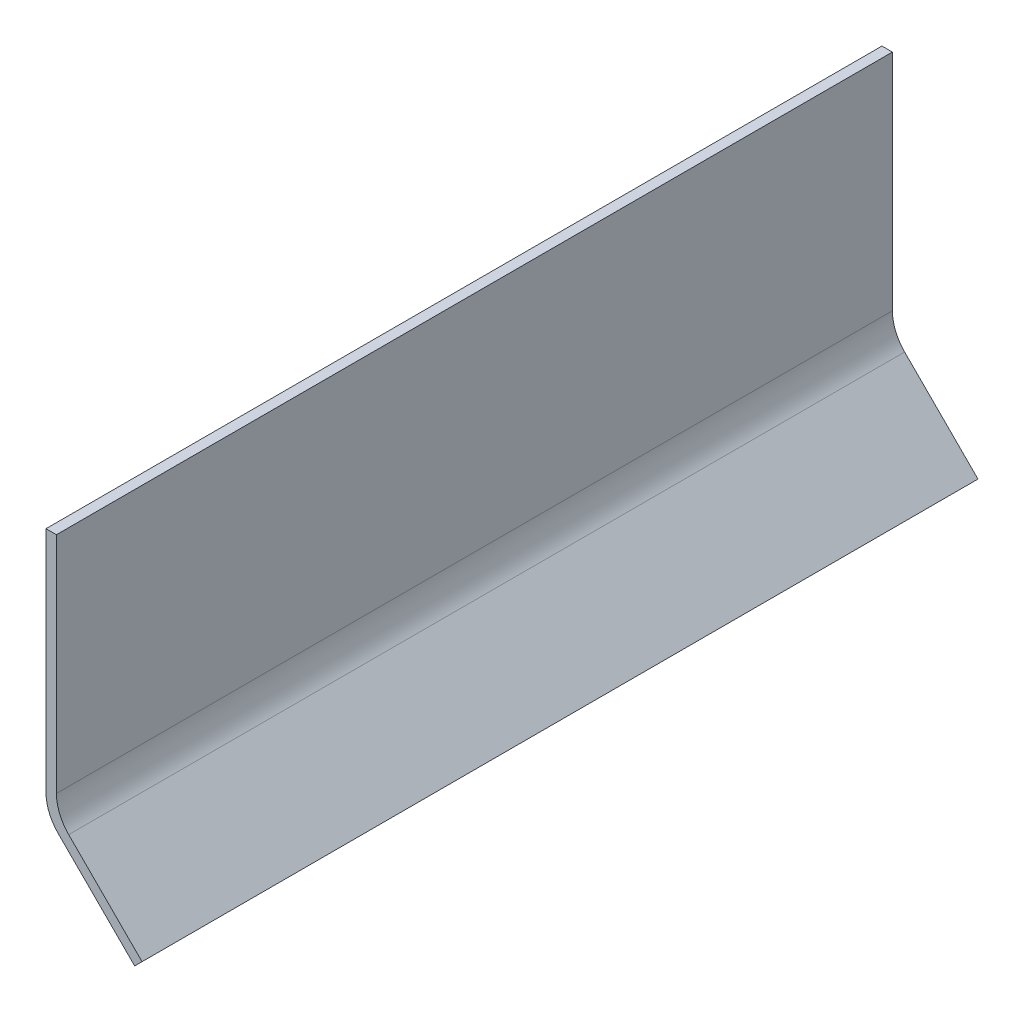
ISO-10303-21;
HEADER;
FILE_DESCRIPTION(('STEP AP214'),'2;1');
FILE_NAME('part.step','',(''),(''),'','','');
FILE_SCHEMA(('AUTOMOTIVE_DESIGN { 1 0 10303 214 1 1 1 1 }'));
ENDSEC;
DATA;
#1=APPLICATION_CONTEXT('core data for automotive mechanical design processes');
#2=APPLICATION_PROTOCOL_DEFINITION('international standard','automotive_design',2000,#1);
#3=PRODUCT_CONTEXT('',#1,'mechanical');
#4=PRODUCT('Part','Part','',(#3));
#5=PRODUCT_RELATED_PRODUCT_CATEGORY('part','',(#4));
#6=PRODUCT_DEFINITION_FORMATION('','',#4);
#7=PRODUCT_DEFINITION_CONTEXT('part definition',#1,'design');
#8=PRODUCT_DEFINITION('design','',#6,#7);
#9=PRODUCT_DEFINITION_SHAPE('','',#8);
#10=(LENGTH_UNIT() NAMED_UNIT(*) SI_UNIT(.MILLI.,.METRE.));
#11=(NAMED_UNIT(*) PLANE_ANGLE_UNIT() SI_UNIT($,.RADIAN.));
#12=(NAMED_UNIT(*) SI_UNIT($,.STERADIAN.) SOLID_ANGLE_UNIT());
#13=UNCERTAINTY_MEASURE_WITH_UNIT(LENGTH_MEASURE(1.E-05),#10,'distance_accuracy_value','');
#14=(GEOMETRIC_REPRESENTATION_CONTEXT(3) GLOBAL_UNCERTAINTY_ASSIGNED_CONTEXT((#13)) GLOBAL_UNIT_ASSIGNED_CONTEXT((#10,
#11,#12)) REPRESENTATION_CONTEXT('',''));
#15=CARTESIAN_POINT('',(0.,0.,0.));
#16=DIRECTION('',(0.,0.,1.));
#17=DIRECTION('',(1.,0.,0.));
#18=AXIS2_PLACEMENT_3D('',#15,#16,#17);
#19=CARTESIAN_POINT('',(0.,50.8,63.5));
#20=DIRECTION('',(0.,-1.,0.));
#21=DIRECTION('',(0.,0.,-1.));
#22=AXIS2_PLACEMENT_3D('',#19,#20,#21);
#23=PLANE('',#22);
#24=DIRECTION('',(-1.,0.,0.));
#25=VECTOR('',#24,1.);
#26=CARTESIAN_POINT('',(0.,50.8,-63.5));
#27=LINE('',#26,#25);
#28=CARTESIAN_POINT('',(1.5875,50.8,-63.5));
#29=VERTEX_POINT('',#28);
#30=CARTESIAN_POINT('',(0.,50.8,-63.5));
#31=VERTEX_POINT('',#30);
#32=EDGE_CURVE('E142',#29,#31,#27,.T.);
#33=ORIENTED_EDGE('',*,*,#32,.T.);
#34=DIRECTION('',(0.,0.,-1.));
#35=VECTOR('',#34,1.);
#36=CARTESIAN_POINT('',(0.,50.8,63.5));
#37=LINE('',#36,#35);
#38=CARTESIAN_POINT('',(0.,50.8,63.5));
#39=VERTEX_POINT('',#38);
#40=EDGE_CURVE('E11',#39,#31,#37,.T.);
#41=ORIENTED_EDGE('',*,*,#40,.F.);
#42=DIRECTION('',(-1.,0.,0.));
#43=VECTOR('',#42,1.);
#44=CARTESIAN_POINT('',(0.,50.8,63.5));
#45=LINE('',#44,#43);
#46=CARTESIAN_POINT('',(1.5875,50.8,63.5));
#47=VERTEX_POINT('',#46);
#48=EDGE_CURVE('E164',#47,#39,#45,.T.);
#49=ORIENTED_EDGE('',*,*,#48,.F.);
#50=DIRECTION('',(0.,0.,-1.));
#51=VECTOR('',#50,1.);
#52=CARTESIAN_POINT('',(1.5875,50.8,63.5));
#53=LINE('',#52,#51);
#54=EDGE_CURVE('E138',#47,#29,#53,.T.);
#55=ORIENTED_EDGE('',*,*,#54,.T.);
#56=EDGE_LOOP('',(#33,#41,#49,#55));
#57=FACE_BOUND('',#56,.T.);
#58=ADVANCED_FACE('F41',(#57),#23,.F.);
#59=CARTESIAN_POINT('',(0.,16.1006403026729,63.5));
#60=DIRECTION('',(1.,0.,0.));
#61=DIRECTION('',(0.,0.,-1.));
#62=AXIS2_PLACEMENT_3D('',#59,#60,#61);
#63=PLANE('',#62);
#64=DIRECTION('',(0.,-1.,0.));
#65=VECTOR('',#64,1.);
#66=CARTESIAN_POINT('',(0.,16.1006403026729,-63.5));
#67=LINE('',#66,#65);
#68=CARTESIAN_POINT('',(0.,16.1006403026729,-63.5));
#69=VERTEX_POINT('',#68);
#70=EDGE_CURVE('E146',#31,#69,#67,.T.);
#71=ORIENTED_EDGE('',*,*,#70,.T.);
#72=DIRECTION('',(0.,0.,-1.));
#73=VECTOR('',#72,1.);
#74=CARTESIAN_POINT('',(0.,16.1006403026729,63.5));
#75=LINE('',#74,#73);
#76=CARTESIAN_POINT('',(0.,16.1006403026729,63.5));
#77=VERTEX_POINT('',#76);
#78=EDGE_CURVE('E50',#77,#69,#75,.T.);
#79=ORIENTED_EDGE('',*,*,#78,.F.);
#80=DIRECTION('',(0.,-1.,0.));
#81=VECTOR('',#80,1.);
#82=CARTESIAN_POINT('',(0.,16.1006403026729,63.5));
#83=LINE('',#82,#81);
#84=EDGE_CURVE('E101',#39,#77,#83,.T.);
#85=ORIENTED_EDGE('',*,*,#84,.F.);
#86=ORIENTED_EDGE('',*,*,#40,.T.);
#87=EDGE_LOOP('',(#71,#79,#85,#86));
#88=FACE_BOUND('',#87,.T.);
#89=ADVANCED_FACE('F210',(#88),#63,.F.);
#90=CARTESIAN_POINT('',(6.35,16.1006403026729,63.5));
#91=DIRECTION('',(0.,0.,-1.));
#92=DIRECTION('',(-1.,0.,0.));
#93=AXIS2_PLACEMENT_3D('',#90,#91,#92);
#94=CYLINDRICAL_SURFACE('',#93,6.35);
#95=CARTESIAN_POINT('',(6.35,16.1006403026729,-63.5));
#96=DIRECTION('',(0.,0.,1.));
#97=DIRECTION('',(-1.,0.,0.));
#98=AXIS2_PLACEMENT_3D('',#95,#96,#97);
#99=CIRCLE('',#98,6.35);
#100=CARTESIAN_POINT('',(1.8598719394654,11.6105122421384,-63.5));
#101=VERTEX_POINT('',#100);
#102=EDGE_CURVE('E149',#69,#101,#99,.T.);
#103=ORIENTED_EDGE('',*,*,#102,.T.);
#104=DIRECTION('',(0.,0.,-1.));
#105=VECTOR('',#104,1.);
#106=CARTESIAN_POINT('',(1.8598719394654,11.6105122421384,63.5));
#107=LINE('',#106,#105);
#108=CARTESIAN_POINT('',(1.8598719394654,11.6105122421384,63.5));
#109=VERTEX_POINT('',#108);
#110=EDGE_CURVE('E175',#109,#101,#107,.T.);
#111=ORIENTED_EDGE('',*,*,#110,.F.);
#112=CARTESIAN_POINT('',(6.35,16.1006403026729,63.5));
#113=DIRECTION('',(0.,0.,1.));
#114=DIRECTION('',(-1.,0.,0.));
#115=AXIS2_PLACEMENT_3D('',#112,#113,#114);
#116=CIRCLE('',#115,6.35);
#117=EDGE_CURVE('E185',#77,#109,#116,.T.);
#118=ORIENTED_EDGE('',*,*,#117,.F.);
#119=ORIENTED_EDGE('',*,*,#78,.T.);
#120=EDGE_LOOP('',(#103,#111,#118,#119));
#121=FACE_BOUND('',#120,.T.);
#122=ADVANCED_FACE('F183',(#121),#94,.T.);
#123=CARTESIAN_POINT('',(1.8598719394654,11.6105122421384,63.5));
#124=DIRECTION('',(0.707106781186552,0.707106781186543,0.));
#125=DIRECTION('',(-0.707106781186543,0.707106781186552,0.));
#126=AXIS2_PLACEMENT_3D('',#123,#124,#125);
#127=PLANE('',#126);
#128=DIRECTION('',(0.707106781186543,-0.707106781186552,0.));
#129=VECTOR('',#128,1.);
#130=CARTESIAN_POINT('',(1.8598719394654,11.6105122421384,-63.5));
#131=LINE('',#130,#129);
#132=CARTESIAN_POINT('',(13.4703841816037,0.,-63.5));
#133=VERTEX_POINT('',#132);
#134=EDGE_CURVE('E152',#101,#133,#131,.T.);
#135=ORIENTED_EDGE('',*,*,#134,.T.);
#136=DIRECTION('',(0.,0.,-1.));
#137=VECTOR('',#136,1.);
#138=CARTESIAN_POINT('',(13.4703841816037,0.,63.5));
#139=LINE('',#138,#137);
#140=CARTESIAN_POINT('',(13.4703841816037,0.,63.5));
#141=VERTEX_POINT('',#140);
#142=EDGE_CURVE('E171',#141,#133,#139,.T.);
#143=ORIENTED_EDGE('',*,*,#142,.F.);
#144=DIRECTION('',(0.707106781186543,-0.707106781186552,0.));
#145=VECTOR('',#144,1.);
#146=CARTESIAN_POINT('',(1.8598719394654,11.6105122421384,63.5));
#147=LINE('',#146,#145);
#148=EDGE_CURVE('E198',#109,#141,#147,.T.);
#149=ORIENTED_EDGE('',*,*,#148,.F.);
#150=ORIENTED_EDGE('',*,*,#110,.T.);
#151=EDGE_LOOP('',(#135,#143,#149,#150));
#152=FACE_BOUND('',#151,.T.);
#153=ADVANCED_FACE('F193',(#152),#127,.F.);
#154=CARTESIAN_POINT('',(14.5929161967373,1.12253201513364,63.5));
#155=DIRECTION('',(-0.707106781186543,0.707106781186552,0.));
#156=DIRECTION('',(-0.707106781186552,-0.707106781186543,0.));
#157=AXIS2_PLACEMENT_3D('',#154,#155,#156);
#158=PLANE('',#157);
#159=DIRECTION('',(0.707106781186552,0.707106781186543,0.));
#160=VECTOR('',#159,1.);
#161=CARTESIAN_POINT('',(14.5929161967373,1.12253201513364,-63.5));
#162=LINE('',#161,#160);
#163=CARTESIAN_POINT('',(14.5929161967373,1.12253201513364,-63.5));
#164=VERTEX_POINT('',#163);
#165=EDGE_CURVE('E155',#133,#164,#162,.T.);
#166=ORIENTED_EDGE('',*,*,#165,.T.);
#167=DIRECTION('',(0.,0.,-1.));
#168=VECTOR('',#167,1.);
#169=CARTESIAN_POINT('',(14.5929161967373,1.12253201513364,63.5));
#170=LINE('',#169,#168);
#171=CARTESIAN_POINT('',(14.5929161967373,1.12253201513364,63.5));
#172=VERTEX_POINT('',#171);
#173=EDGE_CURVE('E131',#172,#164,#170,.T.);
#174=ORIENTED_EDGE('',*,*,#173,.F.);
#175=DIRECTION('',(0.707106781186552,0.707106781186543,0.));
#176=VECTOR('',#175,1.);
#177=CARTESIAN_POINT('',(14.5929161967373,1.12253201513364,63.5));
#178=LINE('',#177,#176);
#179=EDGE_CURVE('E120',#141,#172,#178,.T.);
#180=ORIENTED_EDGE('',*,*,#179,.F.);
#181=ORIENTED_EDGE('',*,*,#142,.T.);
#182=EDGE_LOOP('',(#166,#174,#180,#181));
#183=FACE_BOUND('',#182,.T.);
#184=ADVANCED_FACE('F196',(#183),#158,.F.);
#185=CARTESIAN_POINT('',(3.4473719394654,12.2680762724057,63.5));
#186=DIRECTION('',(-0.707106781186552,-0.707106781186543,0.));
#187=DIRECTION('',(0.707106781186543,-0.707106781186552,0.));
#188=AXIS2_PLACEMENT_3D('',#185,#186,#187);
#189=PLANE('',#188);
#190=DIRECTION('',(-0.707106781186543,0.707106781186552,0.));
#191=VECTOR('',#190,1.);
#192=CARTESIAN_POINT('',(3.4473719394654,12.2680762724057,-63.5));
#193=LINE('',#192,#191);
#194=CARTESIAN_POINT('',(3.4473719394654,12.2680762724057,-63.5));
#195=VERTEX_POINT('',#194);
#196=EDGE_CURVE('E129',#164,#195,#193,.T.);
#197=ORIENTED_EDGE('',*,*,#196,.T.);
#198=DIRECTION('',(0.,0.,-1.));
#199=VECTOR('',#198,1.);
#200=CARTESIAN_POINT('',(3.4473719394654,12.2680762724057,63.5));
#201=LINE('',#200,#199);
#202=CARTESIAN_POINT('',(3.4473719394654,12.2680762724057,63.5));
#203=VERTEX_POINT('',#202);
#204=EDGE_CURVE('E126',#203,#195,#201,.T.);
#205=ORIENTED_EDGE('',*,*,#204,.F.);
#206=DIRECTION('',(-0.707106781186543,0.707106781186552,0.));
#207=VECTOR('',#206,1.);
#208=CARTESIAN_POINT('',(3.4473719394654,12.2680762724057,63.5));
#209=LINE('',#208,#207);
#210=EDGE_CURVE('E114',#172,#203,#209,.T.);
#211=ORIENTED_EDGE('',*,*,#210,.F.);
#212=ORIENTED_EDGE('',*,*,#173,.T.);
#213=EDGE_LOOP('',(#197,#205,#211,#212));
#214=FACE_BOUND('',#213,.T.);
#215=ADVANCED_FACE('F127',(#214),#189,.F.);
#216=CARTESIAN_POINT('',(7.93750000000001,16.7582043329402,63.5));
#217=DIRECTION('',(0.,0.,-1.));
#218=DIRECTION('',(-1.,0.,0.));
#219=AXIS2_PLACEMENT_3D('',#216,#217,#218);
#220=CYLINDRICAL_SURFACE('',#219,6.35);
#221=CARTESIAN_POINT('',(7.93750000000001,16.7582043329402,-63.5));
#222=DIRECTION('',(0.,0.,-1.));
#223=DIRECTION('',(1.,0.,0.));
#224=AXIS2_PLACEMENT_3D('',#221,#222,#223);
#225=CIRCLE('',#224,6.35);
#226=CARTESIAN_POINT('',(1.58750000000001,16.7582043329402,-63.5));
#227=VERTEX_POINT('',#226);
#228=EDGE_CURVE('E87',#195,#227,#225,.T.);
#229=ORIENTED_EDGE('',*,*,#228,.T.);
#230=DIRECTION('',(0.,0.,-1.));
#231=VECTOR('',#230,1.);
#232=CARTESIAN_POINT('',(1.58750000000001,16.7582043329402,63.5));
#233=LINE('',#232,#231);
#234=CARTESIAN_POINT('',(1.58750000000001,16.7582043329402,63.5));
#235=VERTEX_POINT('',#234);
#236=EDGE_CURVE('E132',#235,#227,#233,.T.);
#237=ORIENTED_EDGE('',*,*,#236,.F.);
#238=CARTESIAN_POINT('',(7.93750000000001,16.7582043329402,63.5));
#239=DIRECTION('',(0.,0.,-1.));
#240=DIRECTION('',(1.,0.,0.));
#241=AXIS2_PLACEMENT_3D('',#238,#239,#240);
#242=CIRCLE('',#241,6.35);
#243=EDGE_CURVE('E118',#203,#235,#242,.T.);
#244=ORIENTED_EDGE('',*,*,#243,.F.);
#245=ORIENTED_EDGE('',*,*,#204,.T.);
#246=EDGE_LOOP('',(#229,#237,#244,#245));
#247=FACE_BOUND('',#246,.T.);
#248=ADVANCED_FACE('F134',(#247),#220,.F.);
#249=CARTESIAN_POINT('',(1.5875,50.8,63.5));
#250=DIRECTION('',(-1.,0.,0.));
#251=DIRECTION('',(0.,-1.,0.));
#252=AXIS2_PLACEMENT_3D('',#249,#250,#251);
#253=PLANE('',#252);
#254=DIRECTION('',(0.,1.,0.));
#255=VECTOR('',#254,1.);
#256=CARTESIAN_POINT('',(1.5875,50.8,-63.5));
#257=LINE('',#256,#255);
#258=EDGE_CURVE('E93',#227,#29,#257,.T.);
#259=ORIENTED_EDGE('',*,*,#258,.T.);
#260=ORIENTED_EDGE('',*,*,#54,.F.);
#261=DIRECTION('',(0.,1.,0.));
#262=VECTOR('',#261,1.);
#263=CARTESIAN_POINT('',(1.5875,50.8,63.5));
#264=LINE('',#263,#262);
#265=EDGE_CURVE('E58',#235,#47,#264,.T.);
#266=ORIENTED_EDGE('',*,*,#265,.F.);
#267=ORIENTED_EDGE('',*,*,#236,.T.);
#268=EDGE_LOOP('',(#259,#260,#266,#267));
#269=FACE_BOUND('',#268,.T.);
#270=ADVANCED_FACE('F226',(#269),#253,.F.);
#271=CARTESIAN_POINT('',(7.93750000000001,16.7582043329402,63.5));
#272=DIRECTION('',(0.,0.,1.));
#273=DIRECTION('',(1.,0.,0.));
#274=AXIS2_PLACEMENT_3D('',#271,#272,#273);
#275=PLANE('',#274);
#276=ORIENTED_EDGE('',*,*,#48,.T.);
#277=ORIENTED_EDGE('',*,*,#84,.T.);
#278=ORIENTED_EDGE('',*,*,#117,.T.);
#279=ORIENTED_EDGE('',*,*,#148,.T.);
#280=ORIENTED_EDGE('',*,*,#179,.T.);
#281=ORIENTED_EDGE('',*,*,#210,.T.);
#282=ORIENTED_EDGE('',*,*,#243,.T.);
#283=ORIENTED_EDGE('',*,*,#265,.T.);
#284=EDGE_LOOP('',(#276,#277,#278,#279,#280,#281,#282,#283));
#285=FACE_BOUND('',#284,.T.);
#286=ADVANCED_FACE('F116',(#285),#275,.T.);
#287=CARTESIAN_POINT('',(7.93750000000001,16.7582043329402,-63.5));
#288=DIRECTION('',(0.,0.,1.));
#289=DIRECTION('',(1.,0.,0.));
#290=AXIS2_PLACEMENT_3D('',#287,#288,#289);
#291=PLANE('',#290);
#292=ORIENTED_EDGE('',*,*,#32,.F.);
#293=ORIENTED_EDGE('',*,*,#258,.F.);
#294=ORIENTED_EDGE('',*,*,#228,.F.);
#295=ORIENTED_EDGE('',*,*,#196,.F.);
#296=ORIENTED_EDGE('',*,*,#165,.F.);
#297=ORIENTED_EDGE('',*,*,#134,.F.);
#298=ORIENTED_EDGE('',*,*,#102,.F.);
#299=ORIENTED_EDGE('',*,*,#70,.F.);
#300=EDGE_LOOP('',(#292,#293,#294,#295,#296,#297,#298,#299));
#301=FACE_BOUND('',#300,.T.);
#302=ADVANCED_FACE('F189',(#301),#291,.F.);
#303=CLOSED_SHELL('',(#58,#89,#122,#153,#184,#215,#248,#270,#286,#302));
#304=MANIFOLD_SOLID_BREP('B2',#303);
#305=ADVANCED_BREP_SHAPE_REPRESENTATION('',(#18,#304),#14);
#306=SHAPE_DEFINITION_REPRESENTATION(#9,#305);
ENDSEC;
END-ISO-10303-21;
